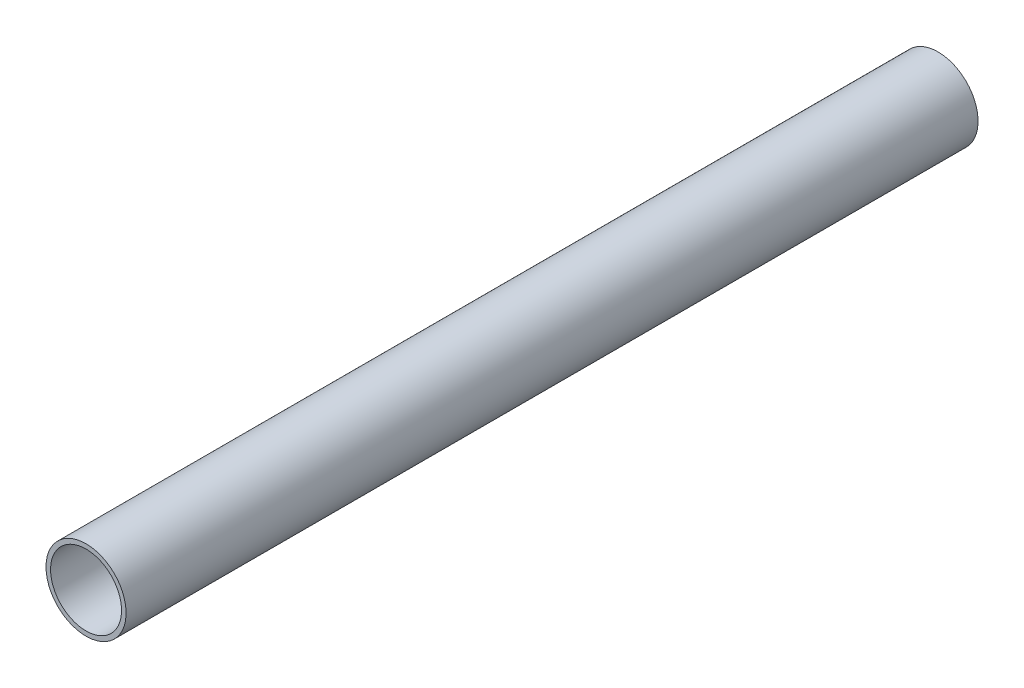
ISO-10303-21;
HEADER;
FILE_DESCRIPTION(('STEP AP214'),'2;1');
FILE_NAME('part.step','',(''),(''),'','','');
FILE_SCHEMA(('AUTOMOTIVE_DESIGN { 1 0 10303 214 1 1 1 1 }'));
ENDSEC;
DATA;
#1=APPLICATION_CONTEXT('core data for automotive mechanical design processes');
#2=APPLICATION_PROTOCOL_DEFINITION('international standard','automotive_design',2000,#1);
#3=PRODUCT_CONTEXT('',#1,'mechanical');
#4=PRODUCT('Part','Part','',(#3));
#5=PRODUCT_RELATED_PRODUCT_CATEGORY('part','',(#4));
#6=PRODUCT_DEFINITION_FORMATION('','',#4);
#7=PRODUCT_DEFINITION_CONTEXT('part definition',#1,'design');
#8=PRODUCT_DEFINITION('design','',#6,#7);
#9=PRODUCT_DEFINITION_SHAPE('','',#8);
#10=(LENGTH_UNIT() NAMED_UNIT(*) SI_UNIT(.MILLI.,.METRE.));
#11=(NAMED_UNIT(*) PLANE_ANGLE_UNIT() SI_UNIT($,.RADIAN.));
#12=(NAMED_UNIT(*) SI_UNIT($,.STERADIAN.) SOLID_ANGLE_UNIT());
#13=UNCERTAINTY_MEASURE_WITH_UNIT(LENGTH_MEASURE(1.E-05),#10,'distance_accuracy_value','');
#14=(GEOMETRIC_REPRESENTATION_CONTEXT(3) GLOBAL_UNCERTAINTY_ASSIGNED_CONTEXT((#13)) GLOBAL_UNIT_ASSIGNED_CONTEXT((#10,
#11,#12)) REPRESENTATION_CONTEXT('',''));
#15=CARTESIAN_POINT('',(0.,0.,0.));
#16=DIRECTION('',(0.,0.,1.));
#17=DIRECTION('',(1.,0.,0.));
#18=AXIS2_PLACEMENT_3D('',#15,#16,#17);
#19=CARTESIAN_POINT('',(0.,0.,152.4));
#20=DIRECTION('',(0.,0.,1.));
#21=DIRECTION('',(1.,0.,0.));
#22=AXIS2_PLACEMENT_3D('',#19,#20,#21);
#23=PLANE('',#22);
#24=CARTESIAN_POINT('',(0.,0.,152.4));
#25=DIRECTION('',(0.,0.,1.));
#26=DIRECTION('',(1.,0.,0.));
#27=AXIS2_PLACEMENT_3D('',#24,#25,#26);
#28=CIRCLE('',#27,14.3256);
#29=CARTESIAN_POINT('',(-14.3256,0.,152.4));
#30=VERTEX_POINT('',#29);
#31=EDGE_CURVE('E10',#30,#30,#28,.T.);
#32=ORIENTED_EDGE('',*,*,#31,.T.);
#33=EDGE_LOOP('',(#32));
#34=FACE_BOUND('',#33,.T.);
#35=CARTESIAN_POINT('',(0.,0.,152.4));
#36=DIRECTION('',(0.,0.,1.));
#37=DIRECTION('',(1.,0.,0.));
#38=AXIS2_PLACEMENT_3D('',#35,#36,#37);
#39=CIRCLE('',#38,12.7);
#40=CARTESIAN_POINT('',(-12.7,0.,152.4));
#41=VERTEX_POINT('',#40);
#42=EDGE_CURVE('E49',#41,#41,#39,.T.);
#43=ORIENTED_EDGE('',*,*,#42,.F.);
#44=EDGE_LOOP('',(#43));
#45=FACE_BOUND('',#44,.T.);
#46=ADVANCED_FACE('F41',(#34,#45),#23,.T.);
#47=CARTESIAN_POINT('',(0.,0.,152.4));
#48=DIRECTION('',(0.,0.,-1.));
#49=DIRECTION('',(-1.,0.,0.));
#50=AXIS2_PLACEMENT_3D('',#47,#48,#49);
#51=CYLINDRICAL_SURFACE('',#50,14.3256);
#52=CARTESIAN_POINT('',(0.,0.,-152.4));
#53=DIRECTION('',(0.,0.,1.));
#54=DIRECTION('',(1.,0.,0.));
#55=AXIS2_PLACEMENT_3D('',#52,#53,#54);
#56=CIRCLE('',#55,14.3256);
#57=CARTESIAN_POINT('',(-14.3256,0.,-152.4));
#58=VERTEX_POINT('',#57);
#59=EDGE_CURVE('E55',#58,#58,#56,.T.);
#60=CARTESIAN_POINT('',(-14.3256,0.,152.4));
#61=CARTESIAN_POINT('',(-14.3256,0.,149.225));
#62=CARTESIAN_POINT('',(-14.3256,0.,146.05));
#63=CARTESIAN_POINT('',(-14.3256,0.,139.7));
#64=CARTESIAN_POINT('',(-14.3256,0.,136.525));
#65=CARTESIAN_POINT('',(-14.3256,0.,130.175));
#66=CARTESIAN_POINT('',(-14.3256,0.,127.));
#67=CARTESIAN_POINT('',(-14.3256,0.,120.65));
#68=CARTESIAN_POINT('',(-14.3256,0.,117.475));
#69=CARTESIAN_POINT('',(-14.3256,0.,111.125));
#70=CARTESIAN_POINT('',(-14.3256,0.,107.95));
#71=CARTESIAN_POINT('',(-14.3256,0.,101.6));
#72=CARTESIAN_POINT('',(-14.3256,0.,98.425));
#73=CARTESIAN_POINT('',(-14.3256,0.,92.075));
#74=CARTESIAN_POINT('',(-14.3256,0.,88.9));
#75=CARTESIAN_POINT('',(-14.3256,0.,82.55));
#76=CARTESIAN_POINT('',(-14.3256,0.,79.375));
#77=CARTESIAN_POINT('',(-14.3256,0.,73.025));
#78=CARTESIAN_POINT('',(-14.3256,0.,69.85));
#79=CARTESIAN_POINT('',(-14.3256,0.,63.5));
#80=CARTESIAN_POINT('',(-14.3256,0.,60.325));
#81=CARTESIAN_POINT('',(-14.3256,0.,53.975));
#82=CARTESIAN_POINT('',(-14.3256,0.,50.8));
#83=CARTESIAN_POINT('',(-14.3256,0.,44.45));
#84=CARTESIAN_POINT('',(-14.3256,0.,41.275));
#85=CARTESIAN_POINT('',(-14.3256,0.,34.925));
#86=CARTESIAN_POINT('',(-14.3256,0.,31.75));
#87=CARTESIAN_POINT('',(-14.3256,0.,25.4));
#88=CARTESIAN_POINT('',(-14.3256,0.,22.225));
#89=CARTESIAN_POINT('',(-14.3256,0.,15.875));
#90=CARTESIAN_POINT('',(-14.3256,0.,12.7));
#91=CARTESIAN_POINT('',(-14.3256,0.,6.34999999999998));
#92=CARTESIAN_POINT('',(-14.3256,0.,3.17499999999997));
#93=CARTESIAN_POINT('',(-14.3256,0.,-3.17500000000003));
#94=CARTESIAN_POINT('',(-14.3256,0.,-6.35000000000003));
#95=CARTESIAN_POINT('',(-14.3256,0.,-12.7));
#96=CARTESIAN_POINT('',(-14.3256,0.,-15.875));
#97=CARTESIAN_POINT('',(-14.3256,0.,-22.225));
#98=CARTESIAN_POINT('',(-14.3256,0.,-25.4));
#99=CARTESIAN_POINT('',(-14.3256,0.,-31.75));
#100=CARTESIAN_POINT('',(-14.3256,0.,-34.925));
#101=CARTESIAN_POINT('',(-14.3256,0.,-41.275));
#102=CARTESIAN_POINT('',(-14.3256,0.,-44.45));
#103=CARTESIAN_POINT('',(-14.3256,0.,-50.8));
#104=CARTESIAN_POINT('',(-14.3256,0.,-53.975));
#105=CARTESIAN_POINT('',(-14.3256,0.,-60.325));
#106=CARTESIAN_POINT('',(-14.3256,0.,-63.5));
#107=CARTESIAN_POINT('',(-14.3256,0.,-69.85));
#108=CARTESIAN_POINT('',(-14.3256,0.,-73.025));
#109=CARTESIAN_POINT('',(-14.3256,0.,-79.375));
#110=CARTESIAN_POINT('',(-14.3256,0.,-82.5500000000001));
#111=CARTESIAN_POINT('',(-14.3256,0.,-88.9));
#112=CARTESIAN_POINT('',(-14.3256,0.,-92.0750000000001));
#113=CARTESIAN_POINT('',(-14.3256,0.,-98.425));
#114=CARTESIAN_POINT('',(-14.3256,0.,-101.6));
#115=CARTESIAN_POINT('',(-14.3256,0.,-107.95));
#116=CARTESIAN_POINT('',(-14.3256,0.,-111.125));
#117=CARTESIAN_POINT('',(-14.3256,0.,-117.475));
#118=CARTESIAN_POINT('',(-14.3256,0.,-120.65));
#119=CARTESIAN_POINT('',(-14.3256,0.,-127.));
#120=CARTESIAN_POINT('',(-14.3256,0.,-130.175));
#121=CARTESIAN_POINT('',(-14.3256,0.,-136.525));
#122=CARTESIAN_POINT('',(-14.3256,0.,-139.7));
#123=CARTESIAN_POINT('',(-14.3256,0.,-146.05));
#124=CARTESIAN_POINT('',(-14.3256,0.,-149.225));
#125=CARTESIAN_POINT('',(-14.3256,0.,-152.4));
#126=B_SPLINE_CURVE_WITH_KNOTS('',3,(#60,#61,#62,#63,#64,#65,#66,#67,#68,#69,#70,#71,#72,#73,
#74,#75,#76,#77,#78,#79,#80,#81,#82,#83,#84,#85,#86,#87,#88,#89,#90,#91,#92,#93,#94,#95,#96,#97,
#98,#99,#100,#101,#102,#103,#104,#105,#106,#107,#108,#109,#110,#111,#112,#113,#114,#115,#116,
#117,#118,#119,#120,#121,#122,#123,#124,#125),.UNSPECIFIED.,.F.,.F.,(4,2,2,2,2,2,2,2,2,2,2,2,2,
2,2,2,2,2,2,2,2,2,2,2,2,2,2,2,2,2,2,2,4),(0.,9.52499999999998,19.05,28.575,38.1,47.625,57.15,
66.675,76.2,85.725,95.25,104.775,114.3,123.825,133.35,142.875,152.4,161.925,171.45,180.975,
190.5,200.025,209.55,219.075,228.6,238.125,247.65,257.175,266.7,276.225,285.75,295.275,304.8),.UNSPECIFIED.);
#127=EDGE_CURVE('BSEAM43',#30,#58,#126,.T.);
#128=ORIENTED_EDGE('',*,*,#31,.F.);
#129=ORIENTED_EDGE('',*,*,#59,.T.);
#130=ORIENTED_EDGE('',*,*,#127,.T.);
#131=ORIENTED_EDGE('',*,*,#127,.F.);
#132=EDGE_LOOP('',(#128,#130,#129,#131));
#133=FACE_BOUND('',#132,.T.);
#134=ADVANCED_FACE('F43',(#133),#51,.T.);
#135=CARTESIAN_POINT('',(0.,0.,152.4));
#136=DIRECTION('',(0.,0.,-1.));
#137=DIRECTION('',(-1.,0.,0.));
#138=AXIS2_PLACEMENT_3D('',#135,#136,#137);
#139=CYLINDRICAL_SURFACE('',#138,12.7);
#140=CARTESIAN_POINT('',(0.,0.,-152.4));
#141=DIRECTION('',(0.,0.,1.));
#142=DIRECTION('',(1.,0.,0.));
#143=AXIS2_PLACEMENT_3D('',#140,#141,#142);
#144=CIRCLE('',#143,12.7);
#145=CARTESIAN_POINT('',(-12.7,0.,-152.4));
#146=VERTEX_POINT('',#145);
#147=EDGE_CURVE('E61',#146,#146,#144,.T.);
#148=CARTESIAN_POINT('',(-12.7,0.,152.4));
#149=CARTESIAN_POINT('',(-12.7,0.,149.225));
#150=CARTESIAN_POINT('',(-12.7,0.,146.05));
#151=CARTESIAN_POINT('',(-12.7,0.,139.7));
#152=CARTESIAN_POINT('',(-12.7,0.,136.525));
#153=CARTESIAN_POINT('',(-12.7,0.,130.175));
#154=CARTESIAN_POINT('',(-12.7,0.,127.));
#155=CARTESIAN_POINT('',(-12.7,0.,120.65));
#156=CARTESIAN_POINT('',(-12.7,0.,117.475));
#157=CARTESIAN_POINT('',(-12.7,0.,111.125));
#158=CARTESIAN_POINT('',(-12.7,0.,107.95));
#159=CARTESIAN_POINT('',(-12.7,0.,101.6));
#160=CARTESIAN_POINT('',(-12.7,0.,98.425));
#161=CARTESIAN_POINT('',(-12.7,0.,92.075));
#162=CARTESIAN_POINT('',(-12.7,0.,88.9));
#163=CARTESIAN_POINT('',(-12.7,0.,82.55));
#164=CARTESIAN_POINT('',(-12.7,0.,79.375));
#165=CARTESIAN_POINT('',(-12.7,0.,73.025));
#166=CARTESIAN_POINT('',(-12.7,0.,69.85));
#167=CARTESIAN_POINT('',(-12.7,0.,63.5));
#168=CARTESIAN_POINT('',(-12.7,0.,60.325));
#169=CARTESIAN_POINT('',(-12.7,0.,53.975));
#170=CARTESIAN_POINT('',(-12.7,0.,50.8));
#171=CARTESIAN_POINT('',(-12.7,0.,44.45));
#172=CARTESIAN_POINT('',(-12.7,0.,41.275));
#173=CARTESIAN_POINT('',(-12.7,0.,34.925));
#174=CARTESIAN_POINT('',(-12.7,0.,31.75));
#175=CARTESIAN_POINT('',(-12.7,0.,25.4));
#176=CARTESIAN_POINT('',(-12.7,0.,22.225));
#177=CARTESIAN_POINT('',(-12.7,0.,15.875));
#178=CARTESIAN_POINT('',(-12.7,0.,12.7));
#179=CARTESIAN_POINT('',(-12.7,0.,6.35));
#180=CARTESIAN_POINT('',(-12.7,0.,3.175));
#181=CARTESIAN_POINT('',(-12.7,0.,-3.175));
#182=CARTESIAN_POINT('',(-12.7,0.,-6.35));
#183=CARTESIAN_POINT('',(-12.7,0.,-12.7));
#184=CARTESIAN_POINT('',(-12.7,0.,-15.875));
#185=CARTESIAN_POINT('',(-12.7,0.,-22.225));
#186=CARTESIAN_POINT('',(-12.7,0.,-25.4));
#187=CARTESIAN_POINT('',(-12.7,0.,-31.75));
#188=CARTESIAN_POINT('',(-12.7,0.,-34.925));
#189=CARTESIAN_POINT('',(-12.7,0.,-41.275));
#190=CARTESIAN_POINT('',(-12.7,0.,-44.45));
#191=CARTESIAN_POINT('',(-12.7,0.,-50.8));
#192=CARTESIAN_POINT('',(-12.7,0.,-53.975));
#193=CARTESIAN_POINT('',(-12.7,0.,-60.325));
#194=CARTESIAN_POINT('',(-12.7,0.,-63.5));
#195=CARTESIAN_POINT('',(-12.7,0.,-69.85));
#196=CARTESIAN_POINT('',(-12.7,0.,-73.025));
#197=CARTESIAN_POINT('',(-12.7,0.,-79.375));
#198=CARTESIAN_POINT('',(-12.7,0.,-82.55));
#199=CARTESIAN_POINT('',(-12.7,0.,-88.9));
#200=CARTESIAN_POINT('',(-12.7,0.,-92.075));
#201=CARTESIAN_POINT('',(-12.7,0.,-98.425));
#202=CARTESIAN_POINT('',(-12.7,0.,-101.6));
#203=CARTESIAN_POINT('',(-12.7,0.,-107.95));
#204=CARTESIAN_POINT('',(-12.7,0.,-111.125));
#205=CARTESIAN_POINT('',(-12.7,0.,-117.475));
#206=CARTESIAN_POINT('',(-12.7,0.,-120.65));
#207=CARTESIAN_POINT('',(-12.7,0.,-127.));
#208=CARTESIAN_POINT('',(-12.7,0.,-130.175));
#209=CARTESIAN_POINT('',(-12.7,0.,-136.525));
#210=CARTESIAN_POINT('',(-12.7,0.,-139.7));
#211=CARTESIAN_POINT('',(-12.7,0.,-146.05));
#212=CARTESIAN_POINT('',(-12.7,0.,-149.225));
#213=CARTESIAN_POINT('',(-12.7,0.,-152.4));
#214=B_SPLINE_CURVE_WITH_KNOTS('',3,(#148,#149,#150,#151,#152,#153,#154,#155,#156,#157,#158,
#159,#160,#161,#162,#163,#164,#165,#166,#167,#168,#169,#170,#171,#172,#173,#174,#175,#176,#177,
#178,#179,#180,#181,#182,#183,#184,#185,#186,#187,#188,#189,#190,#191,#192,#193,#194,#195,#196,
#197,#198,#199,#200,#201,#202,#203,#204,#205,#206,#207,#208,#209,#210,#211,#212,#213),
.UNSPECIFIED.,.F.,.F.,(4,2,2,2,2,2,2,2,2,2,2,2,2,2,2,2,2,2,2,2,2,2,2,2,2,2,2,2,2,2,2,2,4),(0.,
9.52500000000001,19.05,28.575,38.1,47.625,57.15,66.675,76.2,85.725,95.25,104.775,114.3,123.825,
133.35,142.875,152.4,161.925,171.45,180.975,190.5,200.025,209.55,219.075,228.6,238.125,247.65,
257.175,266.7,276.225,285.75,295.275,304.8),.UNSPECIFIED.);
#215=EDGE_CURVE('BSEAM72',#41,#146,#214,.T.);
#216=ORIENTED_EDGE('',*,*,#42,.T.);
#217=ORIENTED_EDGE('',*,*,#147,.F.);
#218=ORIENTED_EDGE('',*,*,#215,.T.);
#219=ORIENTED_EDGE('',*,*,#215,.F.);
#220=EDGE_LOOP('',(#216,#218,#217,#219));
#221=FACE_BOUND('',#220,.T.);
#222=ADVANCED_FACE('F72',(#221),#139,.F.);
#223=CARTESIAN_POINT('',(0.,0.,-152.4));
#224=DIRECTION('',(0.,0.,1.));
#225=DIRECTION('',(1.,0.,0.));
#226=AXIS2_PLACEMENT_3D('',#223,#224,#225);
#227=PLANE('',#226);
#228=ORIENTED_EDGE('',*,*,#147,.T.);
#229=EDGE_LOOP('',(#228));
#230=FACE_BOUND('',#229,.T.);
#231=ORIENTED_EDGE('',*,*,#59,.F.);
#232=EDGE_LOOP('',(#231));
#233=FACE_BOUND('',#232,.T.);
#234=ADVANCED_FACE('F69',(#230,#233),#227,.F.);
#235=CLOSED_SHELL('',(#46,#134,#222,#234));
#236=MANIFOLD_SOLID_BREP('B2',#235);
#237=ADVANCED_BREP_SHAPE_REPRESENTATION('',(#18,#236),#14);
#238=SHAPE_DEFINITION_REPRESENTATION(#9,#237);
ENDSEC;
END-ISO-10303-21;
